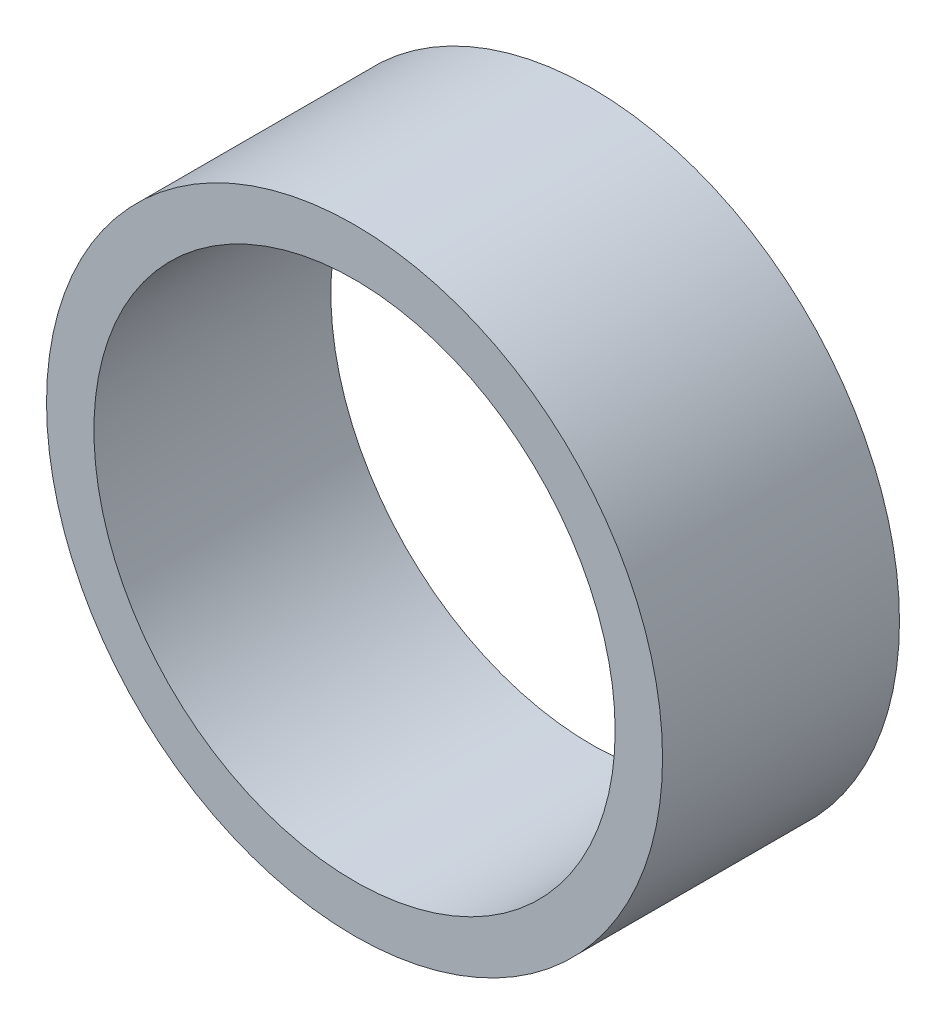
ISO-10303-21;
HEADER;
FILE_DESCRIPTION(('STEP AP214'),'2;1');
FILE_NAME('part.step','',(''),(''),'','','');
FILE_SCHEMA(('AUTOMOTIVE_DESIGN { 1 0 10303 214 1 1 1 1 }'));
ENDSEC;
DATA;
#1=APPLICATION_CONTEXT('core data for automotive mechanical design processes');
#2=APPLICATION_PROTOCOL_DEFINITION('international standard','automotive_design',2000,#1);
#3=PRODUCT_CONTEXT('',#1,'mechanical');
#4=PRODUCT('Part','Part','',(#3));
#5=PRODUCT_RELATED_PRODUCT_CATEGORY('part','',(#4));
#6=PRODUCT_DEFINITION_FORMATION('','',#4);
#7=PRODUCT_DEFINITION_CONTEXT('part definition',#1,'design');
#8=PRODUCT_DEFINITION('design','',#6,#7);
#9=PRODUCT_DEFINITION_SHAPE('','',#8);
#10=(LENGTH_UNIT() NAMED_UNIT(*) SI_UNIT(.MILLI.,.METRE.));
#11=(NAMED_UNIT(*) PLANE_ANGLE_UNIT() SI_UNIT($,.RADIAN.));
#12=(NAMED_UNIT(*) SI_UNIT($,.STERADIAN.) SOLID_ANGLE_UNIT());
#13=UNCERTAINTY_MEASURE_WITH_UNIT(LENGTH_MEASURE(1.E-05),#10,'distance_accuracy_value','');
#14=(GEOMETRIC_REPRESENTATION_CONTEXT(3) GLOBAL_UNCERTAINTY_ASSIGNED_CONTEXT((#13)) GLOBAL_UNIT_ASSIGNED_CONTEXT((#10,
#11,#12)) REPRESENTATION_CONTEXT('',''));
#15=CARTESIAN_POINT('',(0.,0.,0.));
#16=DIRECTION('',(0.,0.,1.));
#17=DIRECTION('',(1.,0.,0.));
#18=AXIS2_PLACEMENT_3D('',#15,#16,#17);
#19=CARTESIAN_POINT('',(0.,0.,2.54));
#20=DIRECTION('',(0.,0.,1.));
#21=DIRECTION('',(1.,0.,0.));
#22=AXIS2_PLACEMENT_3D('',#19,#20,#21);
#23=PLANE('',#22);
#24=CARTESIAN_POINT('',(0.,0.,2.54));
#25=DIRECTION('',(0.,0.,1.));
#26=DIRECTION('',(1.,0.,0.));
#27=AXIS2_PLACEMENT_3D('',#24,#25,#26);
#28=CIRCLE('',#27,3.302);
#29=CARTESIAN_POINT('',(3.302,0.,2.54));
#30=VERTEX_POINT('',#29);
#31=EDGE_CURVE('E10',#30,#30,#28,.T.);
#32=ORIENTED_EDGE('',*,*,#31,.T.);
#33=EDGE_LOOP('',(#32));
#34=FACE_BOUND('',#33,.T.);
#35=CARTESIAN_POINT('',(0.,0.,2.54));
#36=DIRECTION('',(0.,0.,1.));
#37=DIRECTION('',(1.,0.,0.));
#38=AXIS2_PLACEMENT_3D('',#35,#36,#37);
#39=CIRCLE('',#38,2.794);
#40=CARTESIAN_POINT('',(2.794,0.,2.54));
#41=VERTEX_POINT('',#40);
#42=EDGE_CURVE('E43',#41,#41,#39,.T.);
#43=ORIENTED_EDGE('',*,*,#42,.F.);
#44=EDGE_LOOP('',(#43));
#45=FACE_BOUND('',#44,.T.);
#46=ADVANCED_FACE('F32',(#34,#45),#23,.T.);
#47=CARTESIAN_POINT('',(0.,0.,0.));
#48=DIRECTION('',(0.,0.,1.));
#49=DIRECTION('',(1.,0.,0.));
#50=AXIS2_PLACEMENT_3D('',#47,#48,#49);
#51=PLANE('',#50);
#52=CARTESIAN_POINT('',(0.,0.,0.));
#53=DIRECTION('',(0.,0.,1.));
#54=DIRECTION('',(1.,0.,0.));
#55=AXIS2_PLACEMENT_3D('',#52,#53,#54);
#56=CIRCLE('',#55,3.302);
#57=CARTESIAN_POINT('',(3.302,0.,0.));
#58=VERTEX_POINT('',#57);
#59=EDGE_CURVE('E36',#58,#58,#56,.T.);
#60=ORIENTED_EDGE('',*,*,#59,.F.);
#61=EDGE_LOOP('',(#60));
#62=FACE_BOUND('',#61,.T.);
#63=CARTESIAN_POINT('',(0.,0.,0.));
#64=DIRECTION('',(0.,0.,1.));
#65=DIRECTION('',(1.,0.,0.));
#66=AXIS2_PLACEMENT_3D('',#63,#64,#65);
#67=CIRCLE('',#66,2.794);
#68=CARTESIAN_POINT('',(2.794,0.,0.));
#69=VERTEX_POINT('',#68);
#70=EDGE_CURVE('E45',#69,#69,#67,.T.);
#71=ORIENTED_EDGE('',*,*,#70,.T.);
#72=EDGE_LOOP('',(#71));
#73=FACE_BOUND('',#72,.T.);
#74=ADVANCED_FACE('F55',(#62,#73),#51,.F.);
#75=CARTESIAN_POINT('',(0.,0.,2.54));
#76=DIRECTION('',(0.,0.,-1.));
#77=DIRECTION('',(-1.,0.,0.));
#78=AXIS2_PLACEMENT_3D('',#75,#76,#77);
#79=CYLINDRICAL_SURFACE('',#78,3.302);
#80=ORIENTED_EDGE('',*,*,#31,.F.);
#81=EDGE_LOOP('',(#80));
#82=FACE_BOUND('',#81,.T.);
#83=ORIENTED_EDGE('',*,*,#59,.T.);
#84=EDGE_LOOP('',(#83));
#85=FACE_BOUND('',#84,.T.);
#86=ADVANCED_FACE('F34',(#82,#85),#79,.T.);
#87=CARTESIAN_POINT('',(0.,0.,2.54));
#88=DIRECTION('',(0.,0.,-1.));
#89=DIRECTION('',(-1.,0.,0.));
#90=AXIS2_PLACEMENT_3D('',#87,#88,#89);
#91=CYLINDRICAL_SURFACE('',#90,2.794);
#92=ORIENTED_EDGE('',*,*,#42,.T.);
#93=EDGE_LOOP('',(#92));
#94=FACE_BOUND('',#93,.T.);
#95=ORIENTED_EDGE('',*,*,#70,.F.);
#96=EDGE_LOOP('',(#95));
#97=FACE_BOUND('',#96,.T.);
#98=ADVANCED_FACE('F51',(#94,#97),#91,.F.);
#99=CLOSED_SHELL('',(#46,#74,#86,#98));
#100=MANIFOLD_SOLID_BREP('B2',#99);
#101=ADVANCED_BREP_SHAPE_REPRESENTATION('',(#18,#100),#14);
#102=SHAPE_DEFINITION_REPRESENTATION(#9,#101);
ENDSEC;
END-ISO-10303-21;
